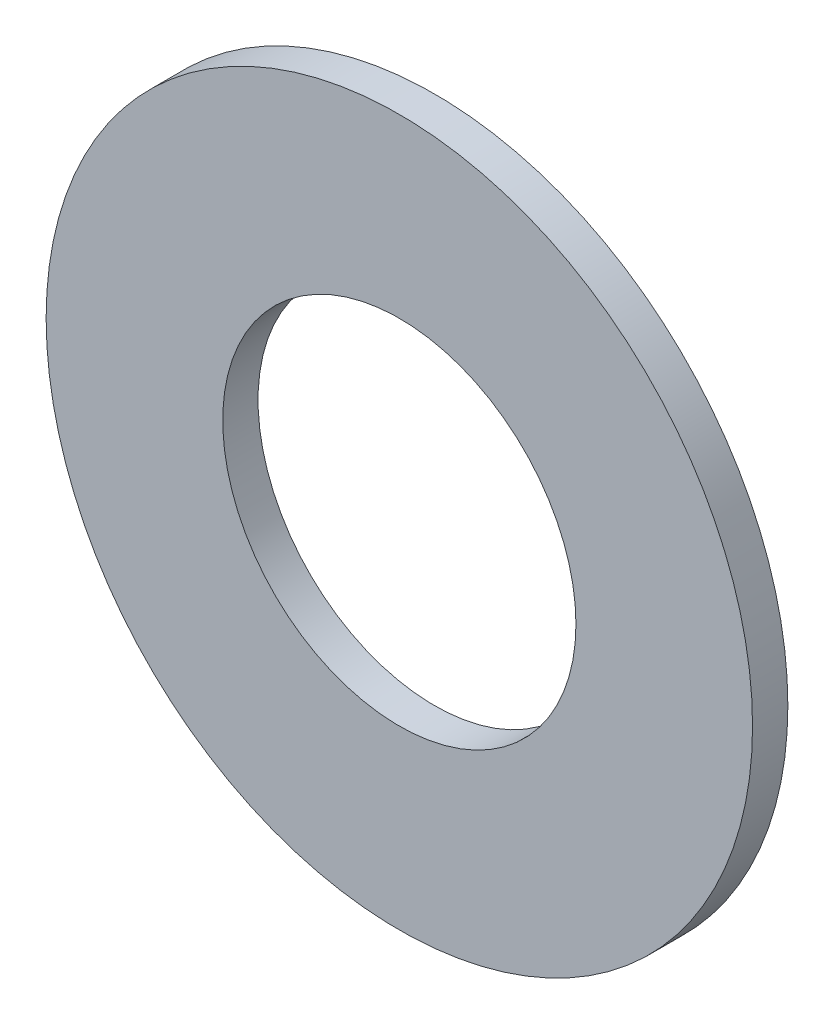
ISO-10303-21;
HEADER;
FILE_DESCRIPTION(('STEP AP214'),'2;1');
FILE_NAME('part.step','',(''),(''),'','','');
FILE_SCHEMA(('AUTOMOTIVE_DESIGN { 1 0 10303 214 1 1 1 1 }'));
ENDSEC;
DATA;
#1=APPLICATION_CONTEXT('core data for automotive mechanical design processes');
#2=APPLICATION_PROTOCOL_DEFINITION('international standard','automotive_design',2000,#1);
#3=PRODUCT_CONTEXT('',#1,'mechanical');
#4=PRODUCT('Part','Part','',(#3));
#5=PRODUCT_RELATED_PRODUCT_CATEGORY('part','',(#4));
#6=PRODUCT_DEFINITION_FORMATION('','',#4);
#7=PRODUCT_DEFINITION_CONTEXT('part definition',#1,'design');
#8=PRODUCT_DEFINITION('design','',#6,#7);
#9=PRODUCT_DEFINITION_SHAPE('','',#8);
#10=(LENGTH_UNIT() NAMED_UNIT(*) SI_UNIT(.MILLI.,.METRE.));
#11=(NAMED_UNIT(*) PLANE_ANGLE_UNIT() SI_UNIT($,.RADIAN.));
#12=(NAMED_UNIT(*) SI_UNIT($,.STERADIAN.) SOLID_ANGLE_UNIT());
#13=UNCERTAINTY_MEASURE_WITH_UNIT(LENGTH_MEASURE(1.E-05),#10,'distance_accuracy_value','');
#14=(GEOMETRIC_REPRESENTATION_CONTEXT(3) GLOBAL_UNCERTAINTY_ASSIGNED_CONTEXT((#13)) GLOBAL_UNIT_ASSIGNED_CONTEXT((#10,
#11,#12)) REPRESENTATION_CONTEXT('',''));
#15=CARTESIAN_POINT('',(0.,0.,0.));
#16=DIRECTION('',(0.,0.,1.));
#17=DIRECTION('',(1.,0.,0.));
#18=AXIS2_PLACEMENT_3D('',#15,#16,#17);
#19=CARTESIAN_POINT('',(0.,0.,0.3));
#20=DIRECTION('',(0.,0.,1.));
#21=DIRECTION('',(1.,0.,0.));
#22=AXIS2_PLACEMENT_3D('',#19,#20,#21);
#23=PLANE('',#22);
#24=CARTESIAN_POINT('',(0.,0.,0.3));
#25=DIRECTION('',(0.,0.,1.));
#26=DIRECTION('',(1.,0.,0.));
#27=AXIS2_PLACEMENT_3D('',#24,#25,#26);
#28=CIRCLE('',#27,3.);
#29=CARTESIAN_POINT('',(3.,0.,0.3));
#30=VERTEX_POINT('',#29);
#31=EDGE_CURVE('E10',#30,#30,#28,.T.);
#32=ORIENTED_EDGE('',*,*,#31,.T.);
#33=EDGE_LOOP('',(#32));
#34=FACE_BOUND('',#33,.T.);
#35=CARTESIAN_POINT('',(0.,0.,0.3));
#36=DIRECTION('',(0.,0.,1.));
#37=DIRECTION('',(1.,0.,0.));
#38=AXIS2_PLACEMENT_3D('',#35,#36,#37);
#39=CIRCLE('',#38,1.5);
#40=CARTESIAN_POINT('',(1.5,0.,0.3));
#41=VERTEX_POINT('',#40);
#42=EDGE_CURVE('E48',#41,#41,#39,.T.);
#43=ORIENTED_EDGE('',*,*,#42,.F.);
#44=EDGE_LOOP('',(#43));
#45=FACE_BOUND('',#44,.T.);
#46=ADVANCED_FACE('F37',(#34,#45),#23,.T.);
#47=CARTESIAN_POINT('',(0.,0.,0.));
#48=DIRECTION('',(0.,0.,1.));
#49=DIRECTION('',(1.,0.,0.));
#50=AXIS2_PLACEMENT_3D('',#47,#48,#49);
#51=PLANE('',#50);
#52=CARTESIAN_POINT('',(0.,0.,0.));
#53=DIRECTION('',(0.,0.,1.));
#54=DIRECTION('',(1.,0.,0.));
#55=AXIS2_PLACEMENT_3D('',#52,#53,#54);
#56=CIRCLE('',#55,3.);
#57=CARTESIAN_POINT('',(3.,0.,0.));
#58=VERTEX_POINT('',#57);
#59=EDGE_CURVE('E41',#58,#58,#56,.T.);
#60=ORIENTED_EDGE('',*,*,#59,.F.);
#61=EDGE_LOOP('',(#60));
#62=FACE_BOUND('',#61,.T.);
#63=CARTESIAN_POINT('',(0.,0.,0.));
#64=DIRECTION('',(0.,0.,1.));
#65=DIRECTION('',(1.,0.,0.));
#66=AXIS2_PLACEMENT_3D('',#63,#64,#65);
#67=CIRCLE('',#66,1.5);
#68=CARTESIAN_POINT('',(1.5,0.,0.));
#69=VERTEX_POINT('',#68);
#70=EDGE_CURVE('E50',#69,#69,#67,.T.);
#71=ORIENTED_EDGE('',*,*,#70,.T.);
#72=EDGE_LOOP('',(#71));
#73=FACE_BOUND('',#72,.T.);
#74=ADVANCED_FACE('F60',(#62,#73),#51,.F.);
#75=CARTESIAN_POINT('',(0.,0.,0.3));
#76=DIRECTION('',(0.,0.,-1.));
#77=DIRECTION('',(-1.,0.,0.));
#78=AXIS2_PLACEMENT_3D('',#75,#76,#77);
#79=CYLINDRICAL_SURFACE('',#78,3.);
#80=ORIENTED_EDGE('',*,*,#31,.F.);
#81=EDGE_LOOP('',(#80));
#82=FACE_BOUND('',#81,.T.);
#83=ORIENTED_EDGE('',*,*,#59,.T.);
#84=EDGE_LOOP('',(#83));
#85=FACE_BOUND('',#84,.T.);
#86=ADVANCED_FACE('F39',(#82,#85),#79,.T.);
#87=CARTESIAN_POINT('',(0.,0.,0.3));
#88=DIRECTION('',(0.,0.,-1.));
#89=DIRECTION('',(-1.,0.,0.));
#90=AXIS2_PLACEMENT_3D('',#87,#88,#89);
#91=CYLINDRICAL_SURFACE('',#90,1.5);
#92=ORIENTED_EDGE('',*,*,#42,.T.);
#93=EDGE_LOOP('',(#92));
#94=FACE_BOUND('',#93,.T.);
#95=ORIENTED_EDGE('',*,*,#70,.F.);
#96=EDGE_LOOP('',(#95));
#97=FACE_BOUND('',#96,.T.);
#98=ADVANCED_FACE('F56',(#94,#97),#91,.F.);
#99=CLOSED_SHELL('',(#46,#74,#86,#98));
#100=MANIFOLD_SOLID_BREP('B2',#99);
#101=ADVANCED_BREP_SHAPE_REPRESENTATION('',(#18,#100),#14);
#102=SHAPE_DEFINITION_REPRESENTATION(#9,#101);
ENDSEC;
END-ISO-10303-21;
